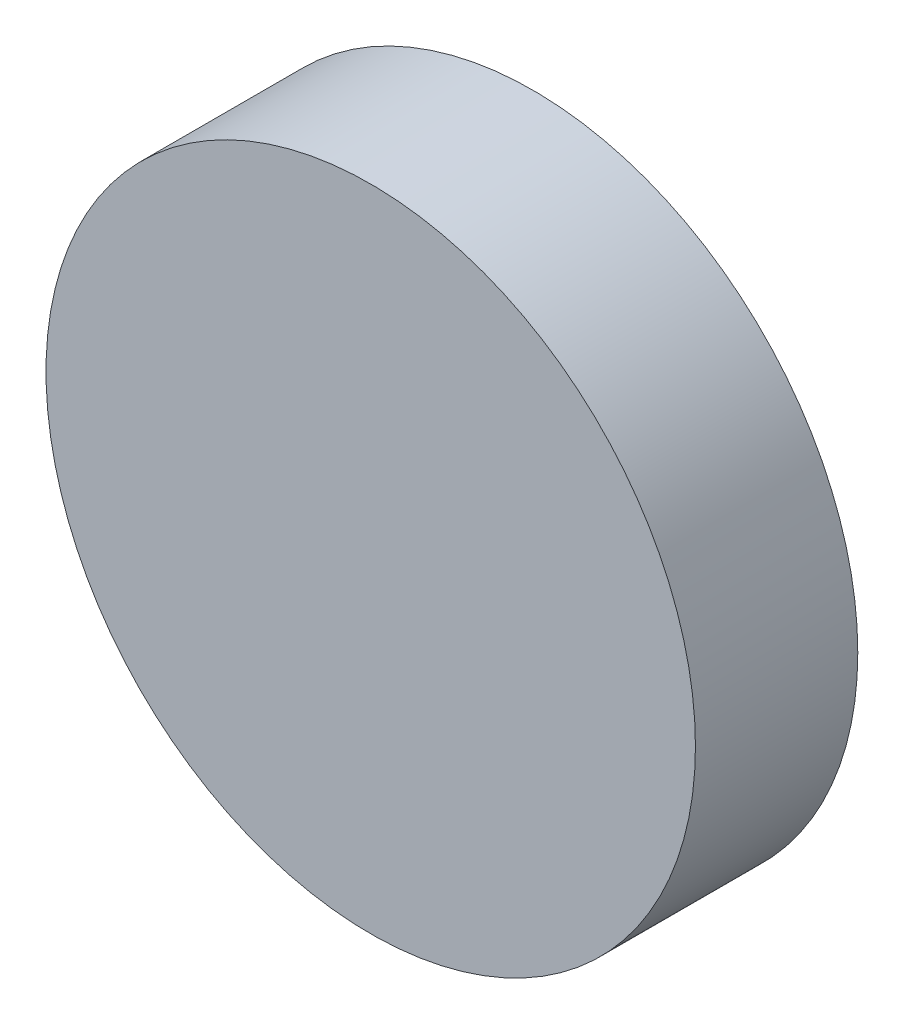
ISO-10303-21;
HEADER;
FILE_DESCRIPTION(('STEP AP214'),'2;1');
FILE_NAME('part.step','',(''),(''),'','','');
FILE_SCHEMA(('AUTOMOTIVE_DESIGN { 1 0 10303 214 1 1 1 1 }'));
ENDSEC;
DATA;
#1=APPLICATION_CONTEXT('core data for automotive mechanical design processes');
#2=APPLICATION_PROTOCOL_DEFINITION('international standard','automotive_design',2000,#1);
#3=PRODUCT_CONTEXT('',#1,'mechanical');
#4=PRODUCT('Part','Part','',(#3));
#5=PRODUCT_RELATED_PRODUCT_CATEGORY('part','',(#4));
#6=PRODUCT_DEFINITION_FORMATION('','',#4);
#7=PRODUCT_DEFINITION_CONTEXT('part definition',#1,'design');
#8=PRODUCT_DEFINITION('design','',#6,#7);
#9=PRODUCT_DEFINITION_SHAPE('','',#8);
#10=(LENGTH_UNIT() NAMED_UNIT(*) SI_UNIT(.MILLI.,.METRE.));
#11=(NAMED_UNIT(*) PLANE_ANGLE_UNIT() SI_UNIT($,.RADIAN.));
#12=(NAMED_UNIT(*) SI_UNIT($,.STERADIAN.) SOLID_ANGLE_UNIT());
#13=UNCERTAINTY_MEASURE_WITH_UNIT(LENGTH_MEASURE(1.E-05),#10,'distance_accuracy_value','');
#14=(GEOMETRIC_REPRESENTATION_CONTEXT(3) GLOBAL_UNCERTAINTY_ASSIGNED_CONTEXT((#13)) GLOBAL_UNIT_ASSIGNED_CONTEXT((#10,
#11,#12)) REPRESENTATION_CONTEXT('',''));
#15=CARTESIAN_POINT('',(0.,0.,0.));
#16=DIRECTION('',(0.,0.,1.));
#17=DIRECTION('',(1.,0.,0.));
#18=AXIS2_PLACEMENT_3D('',#15,#16,#17);
#19=CARTESIAN_POINT('',(-30.291010943861,15.9181554243094,12.7));
#20=DIRECTION('',(0.,0.,-1.));
#21=DIRECTION('',(-1.,0.,0.));
#22=AXIS2_PLACEMENT_3D('',#19,#20,#21);
#23=CYLINDRICAL_SURFACE('',#22,25.4);
#24=CARTESIAN_POINT('',(-30.291010943861,15.9181554243094,12.7));
#25=DIRECTION('',(0.,0.,1.));
#26=DIRECTION('',(1.,0.,0.));
#27=AXIS2_PLACEMENT_3D('',#24,#25,#26);
#28=CIRCLE('',#27,25.4);
#29=CARTESIAN_POINT('',(-4.89101094386095,15.9181554243094,12.7));
#30=VERTEX_POINT('',#29);
#31=EDGE_CURVE('E10',#30,#30,#28,.T.);
#32=ORIENTED_EDGE('',*,*,#31,.F.);
#33=EDGE_LOOP('',(#32));
#34=FACE_BOUND('',#33,.T.);
#35=CARTESIAN_POINT('',(-30.291010943861,15.9181554243094,0.));
#36=DIRECTION('',(0.,0.,1.));
#37=DIRECTION('',(1.,0.,0.));
#38=AXIS2_PLACEMENT_3D('',#35,#36,#37);
#39=CIRCLE('',#38,25.4);
#40=CARTESIAN_POINT('',(-4.89101094386095,15.9181554243094,0.));
#41=VERTEX_POINT('',#40);
#42=EDGE_CURVE('E40',#41,#41,#39,.T.);
#43=ORIENTED_EDGE('',*,*,#42,.T.);
#44=EDGE_LOOP('',(#43));
#45=FACE_BOUND('',#44,.T.);
#46=ADVANCED_FACE('F37',(#34,#45),#23,.T.);
#47=CARTESIAN_POINT('',(-30.291010943861,15.9181554243094,12.7));
#48=DIRECTION('',(0.,0.,1.));
#49=DIRECTION('',(1.,0.,0.));
#50=AXIS2_PLACEMENT_3D('',#47,#48,#49);
#51=PLANE('',#50);
#52=ORIENTED_EDGE('',*,*,#31,.T.);
#53=EDGE_LOOP('',(#52));
#54=FACE_BOUND('',#53,.T.);
#55=ADVANCED_FACE('F54',(#54),#51,.T.);
#56=CARTESIAN_POINT('',(-30.291010943861,15.9181554243094,0.));
#57=DIRECTION('',(0.,0.,1.));
#58=DIRECTION('',(1.,0.,0.));
#59=AXIS2_PLACEMENT_3D('',#56,#57,#58);
#60=PLANE('',#59);
#61=ORIENTED_EDGE('',*,*,#42,.F.);
#62=EDGE_LOOP('',(#61));
#63=FACE_BOUND('',#62,.T.);
#64=ADVANCED_FACE('F52',(#63),#60,.F.);
#65=CLOSED_SHELL('',(#46,#55,#64));
#66=MANIFOLD_SOLID_BREP('B2',#65);
#67=ADVANCED_BREP_SHAPE_REPRESENTATION('',(#18,#66),#14);
#68=SHAPE_DEFINITION_REPRESENTATION(#9,#67);
ENDSEC;
END-ISO-10303-21;
